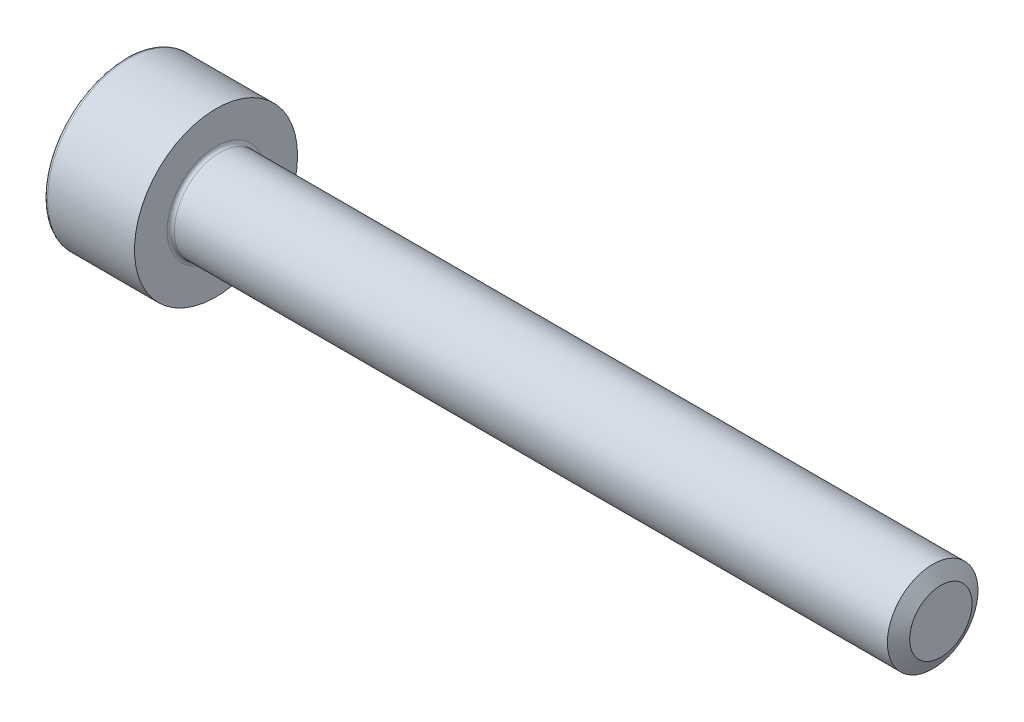
ISO-10303-21;
HEADER;
FILE_DESCRIPTION(('STEP AP214'),'2;1');
FILE_NAME('part.step','',(''),(''),'','','');
FILE_SCHEMA(('AUTOMOTIVE_DESIGN { 1 0 10303 214 1 1 1 1 }'));
ENDSEC;
DATA;
#1=APPLICATION_CONTEXT('core data for automotive mechanical design processes');
#2=APPLICATION_PROTOCOL_DEFINITION('international standard','automotive_design',2000,#1);
#3=PRODUCT_CONTEXT('',#1,'mechanical');
#4=PRODUCT('Part','Part','',(#3));
#5=PRODUCT_RELATED_PRODUCT_CATEGORY('part','',(#4));
#6=PRODUCT_DEFINITION_FORMATION('','',#4);
#7=PRODUCT_DEFINITION_CONTEXT('part definition',#1,'design');
#8=PRODUCT_DEFINITION('design','',#6,#7);
#9=PRODUCT_DEFINITION_SHAPE('','',#8);
#10=(LENGTH_UNIT() NAMED_UNIT(*) SI_UNIT(.MILLI.,.METRE.));
#11=(NAMED_UNIT(*) PLANE_ANGLE_UNIT() SI_UNIT($,.RADIAN.));
#12=(NAMED_UNIT(*) SI_UNIT($,.STERADIAN.) SOLID_ANGLE_UNIT());
#13=UNCERTAINTY_MEASURE_WITH_UNIT(LENGTH_MEASURE(1.E-05),#10,'distance_accuracy_value','');
#14=(GEOMETRIC_REPRESENTATION_CONTEXT(3) GLOBAL_UNCERTAINTY_ASSIGNED_CONTEXT((#13)) GLOBAL_UNIT_ASSIGNED_CONTEXT((#10,
#11,#12)) REPRESENTATION_CONTEXT('',''));
#15=CARTESIAN_POINT('',(0.,0.,0.));
#16=DIRECTION('',(0.,0.,1.));
#17=DIRECTION('',(1.,0.,0.));
#18=AXIS2_PLACEMENT_3D('',#15,#16,#17);
#19=CARTESIAN_POINT('',(0.,0.,0.));
#20=DIRECTION('',(1.,0.,0.));
#21=DIRECTION('',(0.,0.,-1.));
#22=AXIS2_PLACEMENT_3D('',#19,#20,#21);
#23=CYLINDRICAL_SURFACE('',#22,1.25);
#24=CARTESIAN_POINT('',(2.6,0.,0.));
#25=DIRECTION('',(1.,0.,0.));
#26=DIRECTION('',(0.,0.,-1.));
#27=AXIS2_PLACEMENT_3D('',#24,#25,#26);
#28=CIRCLE('',#27,1.25);
#29=CARTESIAN_POINT('',(2.6,0.,-1.25));
#30=VERTEX_POINT('',#29);
#31=EDGE_CURVE('E150',#30,#30,#28,.T.);
#32=ORIENTED_EDGE('',*,*,#31,.T.);
#33=EDGE_LOOP('',(#32));
#34=FACE_BOUND('',#33,.T.);
#35=CARTESIAN_POINT('',(22.275,0.,0.));
#36=DIRECTION('',(-1.,0.,0.));
#37=DIRECTION('',(0.,0.,1.));
#38=AXIS2_PLACEMENT_3D('',#35,#36,#37);
#39=CIRCLE('',#38,1.25);
#40=CARTESIAN_POINT('',(22.275,0.,1.25));
#41=VERTEX_POINT('',#40);
#42=EDGE_CURVE('E292',#41,#41,#39,.T.);
#43=ORIENTED_EDGE('',*,*,#42,.T.);
#44=EDGE_LOOP('',(#43));
#45=FACE_BOUND('',#44,.T.);
#46=ADVANCED_FACE('F47',(#34,#45),#23,.T.);
#47=CARTESIAN_POINT('',(0.,0.,0.));
#48=DIRECTION('',(-1.,0.,0.));
#49=DIRECTION('',(0.,0.,1.));
#50=AXIS2_PLACEMENT_3D('',#47,#48,#49);
#51=PLANE('',#50);
#52=CARTESIAN_POINT('',(0.,0.,0.));
#53=DIRECTION('',(-1.,0.,0.));
#54=DIRECTION('',(0.,0.,1.));
#55=AXIS2_PLACEMENT_3D('',#52,#53,#54);
#56=CIRCLE('',#55,2.15);
#57=CARTESIAN_POINT('',(0.,0.,2.15));
#58=VERTEX_POINT('',#57);
#59=EDGE_CURVE('E11',#58,#58,#56,.T.);
#60=ORIENTED_EDGE('',*,*,#59,.T.);
#61=EDGE_LOOP('',(#60));
#62=FACE_BOUND('',#61,.T.);
#63=DIRECTION('',(0.,0.5,0.866025403784439));
#64=VECTOR('',#63,1.);
#65=CARTESIAN_POINT('',(0.,-1.15,0.));
#66=LINE('',#65,#64);
#67=CARTESIAN_POINT('',(0.,-1.15,0.));
#68=VERTEX_POINT('',#67);
#69=CARTESIAN_POINT('',(0.,-0.575,0.995929214352104));
#70=VERTEX_POINT('',#69);
#71=EDGE_CURVE('E62',#68,#70,#66,.T.);
#72=ORIENTED_EDGE('',*,*,#71,.F.);
#73=DIRECTION('',(0.,-0.5,0.866025403784439));
#74=VECTOR('',#73,1.);
#75=CARTESIAN_POINT('',(0.,-0.575,-0.995929214352104));
#76=LINE('',#75,#74);
#77=CARTESIAN_POINT('',(0.,-0.575,-0.995929214352104));
#78=VERTEX_POINT('',#77);
#79=EDGE_CURVE('E146',#78,#68,#76,.T.);
#80=ORIENTED_EDGE('',*,*,#79,.F.);
#81=DIRECTION('',(0.,-1.,0.));
#82=VECTOR('',#81,1.);
#83=CARTESIAN_POINT('',(0.,0.575,-0.995929214352104));
#84=LINE('',#83,#82);
#85=CARTESIAN_POINT('',(0.,0.575,-0.995929214352104));
#86=VERTEX_POINT('',#85);
#87=EDGE_CURVE('E144',#86,#78,#84,.T.);
#88=ORIENTED_EDGE('',*,*,#87,.F.);
#89=DIRECTION('',(0.,-0.5,-0.866025403784439));
#90=VECTOR('',#89,1.);
#91=CARTESIAN_POINT('',(0.,1.15,0.));
#92=LINE('',#91,#90);
#93=CARTESIAN_POINT('',(0.,1.15,0.));
#94=VERTEX_POINT('',#93);
#95=EDGE_CURVE('E110',#94,#86,#92,.T.);
#96=ORIENTED_EDGE('',*,*,#95,.F.);
#97=DIRECTION('',(0.,0.5,-0.866025403784439));
#98=VECTOR('',#97,1.);
#99=CARTESIAN_POINT('',(0.,0.575,0.995929214352104));
#100=LINE('',#99,#98);
#101=CARTESIAN_POINT('',(0.,0.575,0.995929214352104));
#102=VERTEX_POINT('',#101);
#103=EDGE_CURVE('E140',#102,#94,#100,.T.);
#104=ORIENTED_EDGE('',*,*,#103,.F.);
#105=DIRECTION('',(0.,1.,0.));
#106=VECTOR('',#105,1.);
#107=CARTESIAN_POINT('',(0.,-0.575,0.995929214352104));
#108=LINE('',#107,#106);
#109=EDGE_CURVE('E136',#70,#102,#108,.T.);
#110=ORIENTED_EDGE('',*,*,#109,.F.);
#111=EDGE_LOOP('',(#72,#80,#88,#96,#104,#110));
#112=FACE_BOUND('',#111,.T.);
#113=ADVANCED_FACE('F186',(#62,#112),#51,.T.);
#114=CARTESIAN_POINT('',(0.,0.,0.));
#115=DIRECTION('',(1.,0.,0.));
#116=DIRECTION('',(0.,0.,-1.));
#117=AXIS2_PLACEMENT_3D('',#114,#115,#116);
#118=CYLINDRICAL_SURFACE('',#117,2.25);
#119=CARTESIAN_POINT('',(0.1,0.,0.));
#120=DIRECTION('',(-1.,0.,0.));
#121=DIRECTION('',(0.,0.,1.));
#122=AXIS2_PLACEMENT_3D('',#119,#120,#121);
#123=CIRCLE('',#122,2.25);
#124=CARTESIAN_POINT('',(0.1,0.,2.25));
#125=VERTEX_POINT('',#124);
#126=EDGE_CURVE('E55',#125,#125,#123,.F.);
#127=ORIENTED_EDGE('',*,*,#126,.T.);
#128=EDGE_LOOP('',(#127));
#129=FACE_BOUND('',#128,.T.);
#130=CARTESIAN_POINT('',(2.5,0.,0.));
#131=DIRECTION('',(1.,0.,0.));
#132=DIRECTION('',(0.,0.,-1.));
#133=AXIS2_PLACEMENT_3D('',#130,#131,#132);
#134=CIRCLE('',#133,2.25);
#135=CARTESIAN_POINT('',(2.5,0.,-2.25));
#136=VERTEX_POINT('',#135);
#137=EDGE_CURVE('E161',#136,#136,#134,.T.);
#138=ORIENTED_EDGE('',*,*,#137,.F.);
#139=EDGE_LOOP('',(#138));
#140=FACE_BOUND('',#139,.T.);
#141=ADVANCED_FACE('F167',(#129,#140),#118,.T.);
#142=CARTESIAN_POINT('',(2.5,2.25,0.));
#143=DIRECTION('',(1.,0.,0.));
#144=DIRECTION('',(0.,0.,-1.));
#145=AXIS2_PLACEMENT_3D('',#142,#143,#144);
#146=PLANE('',#145);
#147=ORIENTED_EDGE('',*,*,#137,.T.);
#148=EDGE_LOOP('',(#147));
#149=FACE_BOUND('',#148,.T.);
#150=CARTESIAN_POINT('',(2.5,0.,0.));
#151=DIRECTION('',(1.,0.,0.));
#152=DIRECTION('',(0.,0.,-1.));
#153=AXIS2_PLACEMENT_3D('',#150,#151,#152);
#154=CIRCLE('',#153,1.35);
#155=CARTESIAN_POINT('',(2.5,0.,-1.35));
#156=VERTEX_POINT('',#155);
#157=EDGE_CURVE('E158',#156,#156,#154,.T.);
#158=ORIENTED_EDGE('',*,*,#157,.F.);
#159=EDGE_LOOP('',(#158));
#160=FACE_BOUND('',#159,.T.);
#161=ADVANCED_FACE('F201',(#149,#160),#146,.T.);
#162=CARTESIAN_POINT('',(2.6,0.,0.));
#163=DIRECTION('',(1.,0.,0.));
#164=DIRECTION('',(0.,0.,-1.));
#165=AXIS2_PLACEMENT_3D('',#162,#163,#164);
#166=TOROIDAL_SURFACE('',#165,1.35,0.0999999999999997);
#167=ORIENTED_EDGE('',*,*,#157,.T.);
#168=EDGE_LOOP('',(#167));
#169=FACE_BOUND('',#168,.T.);
#170=ORIENTED_EDGE('',*,*,#31,.F.);
#171=EDGE_LOOP('',(#170));
#172=FACE_BOUND('',#171,.T.);
#173=ADVANCED_FACE('F197',(#169,#172),#166,.F.);
#174=CARTESIAN_POINT('',(1.1,-1.15,0.));
#175=DIRECTION('',(0.,-0.866025403784439,0.5));
#176=DIRECTION('',(0.,-0.5,-0.866025403784439));
#177=AXIS2_PLACEMENT_3D('',#174,#175,#176);
#178=PLANE('',#177);
#179=ORIENTED_EDGE('',*,*,#71,.T.);
#180=DIRECTION('',(-1.,0.,0.));
#181=VECTOR('',#180,1.);
#182=CARTESIAN_POINT('',(1.1,-0.575,0.995929214352104));
#183=LINE('',#182,#181);
#184=CARTESIAN_POINT('',(1.1,-0.575,0.995929214352104));
#185=VERTEX_POINT('',#184);
#186=EDGE_CURVE('E92',#185,#70,#183,.T.);
#187=ORIENTED_EDGE('',*,*,#186,.F.);
#188=DIRECTION('',(0.,0.5,0.866025403784439));
#189=VECTOR('',#188,1.);
#190=CARTESIAN_POINT('',(1.1,-1.15,0.));
#191=LINE('',#190,#189);
#192=CARTESIAN_POINT('',(1.1,-1.15,0.));
#193=VERTEX_POINT('',#192);
#194=EDGE_CURVE('E148',#193,#185,#191,.T.);
#195=ORIENTED_EDGE('',*,*,#194,.F.);
#196=DIRECTION('',(-1.,0.,0.));
#197=VECTOR('',#196,1.);
#198=CARTESIAN_POINT('',(1.1,-1.15,0.));
#199=LINE('',#198,#197);
#200=EDGE_CURVE('E70',#193,#68,#199,.T.);
#201=ORIENTED_EDGE('',*,*,#200,.T.);
#202=EDGE_LOOP('',(#179,#187,#195,#201));
#203=FACE_BOUND('',#202,.T.);
#204=ADVANCED_FACE('F200',(#203),#178,.F.);
#205=CARTESIAN_POINT('',(1.1,-0.575,-0.995929214352104));
#206=DIRECTION('',(0.,-0.866025403784439,-0.5));
#207=DIRECTION('',(0.,0.5,-0.866025403784439));
#208=AXIS2_PLACEMENT_3D('',#205,#206,#207);
#209=PLANE('',#208);
#210=ORIENTED_EDGE('',*,*,#79,.T.);
#211=ORIENTED_EDGE('',*,*,#200,.F.);
#212=DIRECTION('',(0.,-0.5,0.866025403784439));
#213=VECTOR('',#212,1.);
#214=CARTESIAN_POINT('',(1.1,-0.575,-0.995929214352104));
#215=LINE('',#214,#213);
#216=CARTESIAN_POINT('',(1.1,-0.575,-0.995929214352104));
#217=VERTEX_POINT('',#216);
#218=EDGE_CURVE('E122',#217,#193,#215,.T.);
#219=ORIENTED_EDGE('',*,*,#218,.F.);
#220=DIRECTION('',(-1.,0.,0.));
#221=VECTOR('',#220,1.);
#222=CARTESIAN_POINT('',(1.1,-0.575,-0.995929214352104));
#223=LINE('',#222,#221);
#224=EDGE_CURVE('E114',#217,#78,#223,.T.);
#225=ORIENTED_EDGE('',*,*,#224,.T.);
#226=EDGE_LOOP('',(#210,#211,#219,#225));
#227=FACE_BOUND('',#226,.T.);
#228=ADVANCED_FACE('F250',(#227),#209,.F.);
#229=CARTESIAN_POINT('',(1.1,0.575,-0.995929214352104));
#230=DIRECTION('',(0.,0.,-1.));
#231=DIRECTION('',(-1.,0.,0.));
#232=AXIS2_PLACEMENT_3D('',#229,#230,#231);
#233=PLANE('',#232);
#234=ORIENTED_EDGE('',*,*,#87,.T.);
#235=ORIENTED_EDGE('',*,*,#224,.F.);
#236=DIRECTION('',(0.,-1.,0.));
#237=VECTOR('',#236,1.);
#238=CARTESIAN_POINT('',(1.1,0.575,-0.995929214352104));
#239=LINE('',#238,#237);
#240=CARTESIAN_POINT('',(1.1,0.575,-0.995929214352104));
#241=VERTEX_POINT('',#240);
#242=EDGE_CURVE('E118',#241,#217,#239,.T.);
#243=ORIENTED_EDGE('',*,*,#242,.F.);
#244=DIRECTION('',(-1.,0.,0.));
#245=VECTOR('',#244,1.);
#246=CARTESIAN_POINT('',(1.1,0.575,-0.995929214352104));
#247=LINE('',#246,#245);
#248=EDGE_CURVE('E103',#241,#86,#247,.T.);
#249=ORIENTED_EDGE('',*,*,#248,.T.);
#250=EDGE_LOOP('',(#234,#235,#243,#249));
#251=FACE_BOUND('',#250,.T.);
#252=ADVANCED_FACE('F119',(#251),#233,.F.);
#253=CARTESIAN_POINT('',(1.1,1.15,0.));
#254=DIRECTION('',(0.,0.866025403784439,-0.5));
#255=DIRECTION('',(0.,0.5,0.866025403784439));
#256=AXIS2_PLACEMENT_3D('',#253,#254,#255);
#257=PLANE('',#256);
#258=ORIENTED_EDGE('',*,*,#95,.T.);
#259=ORIENTED_EDGE('',*,*,#248,.F.);
#260=DIRECTION('',(0.,-0.5,-0.866025403784439));
#261=VECTOR('',#260,1.);
#262=CARTESIAN_POINT('',(1.1,1.15,0.));
#263=LINE('',#262,#261);
#264=CARTESIAN_POINT('',(1.1,1.15,0.));
#265=VERTEX_POINT('',#264);
#266=EDGE_CURVE('E107',#265,#241,#263,.T.);
#267=ORIENTED_EDGE('',*,*,#266,.F.);
#268=DIRECTION('',(-1.,0.,0.));
#269=VECTOR('',#268,1.);
#270=CARTESIAN_POINT('',(1.1,1.15,0.));
#271=LINE('',#270,#269);
#272=EDGE_CURVE('E115',#265,#94,#271,.T.);
#273=ORIENTED_EDGE('',*,*,#272,.T.);
#274=EDGE_LOOP('',(#258,#259,#267,#273));
#275=FACE_BOUND('',#274,.T.);
#276=ADVANCED_FACE('F105',(#275),#257,.F.);
#277=CARTESIAN_POINT('',(1.1,0.575,0.995929214352104));
#278=DIRECTION('',(0.,0.866025403784439,0.5));
#279=DIRECTION('',(0.,-0.5,0.866025403784439));
#280=AXIS2_PLACEMENT_3D('',#277,#278,#279);
#281=PLANE('',#280);
#282=ORIENTED_EDGE('',*,*,#103,.T.);
#283=ORIENTED_EDGE('',*,*,#272,.F.);
#284=DIRECTION('',(0.,0.5,-0.866025403784439));
#285=VECTOR('',#284,1.);
#286=CARTESIAN_POINT('',(1.1,0.575,0.995929214352104));
#287=LINE('',#286,#285);
#288=CARTESIAN_POINT('',(1.1,0.575,0.995929214352104));
#289=VERTEX_POINT('',#288);
#290=EDGE_CURVE('E128',#289,#265,#287,.T.);
#291=ORIENTED_EDGE('',*,*,#290,.F.);
#292=DIRECTION('',(-1.,0.,0.));
#293=VECTOR('',#292,1.);
#294=CARTESIAN_POINT('',(1.1,0.575,0.995929214352104));
#295=LINE('',#294,#293);
#296=EDGE_CURVE('E153',#289,#102,#295,.T.);
#297=ORIENTED_EDGE('',*,*,#296,.T.);
#298=EDGE_LOOP('',(#282,#283,#291,#297));
#299=FACE_BOUND('',#298,.T.);
#300=ADVANCED_FACE('F226',(#299),#281,.F.);
#301=CARTESIAN_POINT('',(1.1,-0.575,0.995929214352104));
#302=DIRECTION('',(0.,0.,1.));
#303=DIRECTION('',(0.,-1.,0.));
#304=AXIS2_PLACEMENT_3D('',#301,#302,#303);
#305=PLANE('',#304);
#306=ORIENTED_EDGE('',*,*,#109,.T.);
#307=ORIENTED_EDGE('',*,*,#296,.F.);
#308=DIRECTION('',(0.,1.,0.));
#309=VECTOR('',#308,1.);
#310=CARTESIAN_POINT('',(1.1,-0.575,0.995929214352104));
#311=LINE('',#310,#309);
#312=EDGE_CURVE('E130',#185,#289,#311,.T.);
#313=ORIENTED_EDGE('',*,*,#312,.F.);
#314=ORIENTED_EDGE('',*,*,#186,.T.);
#315=EDGE_LOOP('',(#306,#307,#313,#314));
#316=FACE_BOUND('',#315,.T.);
#317=ADVANCED_FACE('F182',(#316),#305,.F.);
#318=CARTESIAN_POINT('',(1.1,-0.575,0.995929214352104));
#319=DIRECTION('',(-1.,0.,0.));
#320=DIRECTION('',(0.,0.,1.));
#321=AXIS2_PLACEMENT_3D('',#318,#319,#320);
#322=PLANE('',#321);
#323=ORIENTED_EDGE('',*,*,#194,.T.);
#324=ORIENTED_EDGE('',*,*,#312,.T.);
#325=ORIENTED_EDGE('',*,*,#290,.T.);
#326=ORIENTED_EDGE('',*,*,#266,.T.);
#327=ORIENTED_EDGE('',*,*,#242,.T.);
#328=ORIENTED_EDGE('',*,*,#218,.T.);
#329=EDGE_LOOP('',(#323,#324,#325,#326,#327,#328));
#330=FACE_BOUND('',#329,.T.);
#331=ADVANCED_FACE('F125',(#330),#322,.T.);
#332=CARTESIAN_POINT('',(0.1,0.,0.));
#333=DIRECTION('',(-1.,0.,0.));
#334=DIRECTION('',(0.,0.,1.));
#335=AXIS2_PLACEMENT_3D('',#332,#333,#334);
#336=TOROIDAL_SURFACE('',#335,2.15,0.1);
#337=ORIENTED_EDGE('',*,*,#59,.F.);
#338=EDGE_LOOP('',(#337));
#339=FACE_BOUND('',#338,.T.);
#340=ORIENTED_EDGE('',*,*,#126,.F.);
#341=EDGE_LOOP('',(#340));
#342=FACE_BOUND('',#341,.T.);
#343=ADVANCED_FACE('F49',(#339,#342),#336,.T.);
#344=CARTESIAN_POINT('',(22.275,0.,0.));
#345=DIRECTION('',(-1.,0.,0.));
#346=DIRECTION('',(0.,0.,1.));
#347=AXIS2_PLACEMENT_3D('',#344,#345,#346);
#348=CONICAL_SURFACE('',#347,1.25,1.04718484902492);
#349=CARTESIAN_POINT('',(22.5,0.,0.));
#350=DIRECTION('',(-1.,0.,0.));
#351=DIRECTION('',(0.,0.,1.));
#352=AXIS2_PLACEMENT_3D('',#349,#350,#351);
#353=CIRCLE('',#352,0.8603);
#354=CARTESIAN_POINT('',(22.5,0.,0.8603));
#355=VERTEX_POINT('',#354);
#356=EDGE_CURVE('E137',#355,#355,#353,.T.);
#357=ORIENTED_EDGE('',*,*,#356,.T.);
#358=EDGE_LOOP('',(#357));
#359=FACE_BOUND('',#358,.T.);
#360=ORIENTED_EDGE('',*,*,#42,.F.);
#361=EDGE_LOOP('',(#360));
#362=FACE_BOUND('',#361,.T.);
#363=ADVANCED_FACE('F171',(#359,#362),#348,.T.);
#364=CARTESIAN_POINT('',(22.5,1.25,0.));
#365=DIRECTION('',(1.,0.,0.));
#366=DIRECTION('',(0.,0.,-1.));
#367=AXIS2_PLACEMENT_3D('',#364,#365,#366);
#368=PLANE('',#367);
#369=ORIENTED_EDGE('',*,*,#356,.F.);
#370=EDGE_LOOP('',(#369));
#371=FACE_BOUND('',#370,.T.);
#372=ADVANCED_FACE('F178',(#371),#368,.T.);
#373=CLOSED_SHELL('',(#46,#113,#141,#161,#173,#204,#228,#252,#276,#300,#317,#331,#343,#363,#372));
#374=MANIFOLD_SOLID_BREP('B2',#373);
#375=ADVANCED_BREP_SHAPE_REPRESENTATION('',(#18,#374),#14);
#376=SHAPE_DEFINITION_REPRESENTATION(#9,#375);
ENDSEC;
END-ISO-10303-21;
